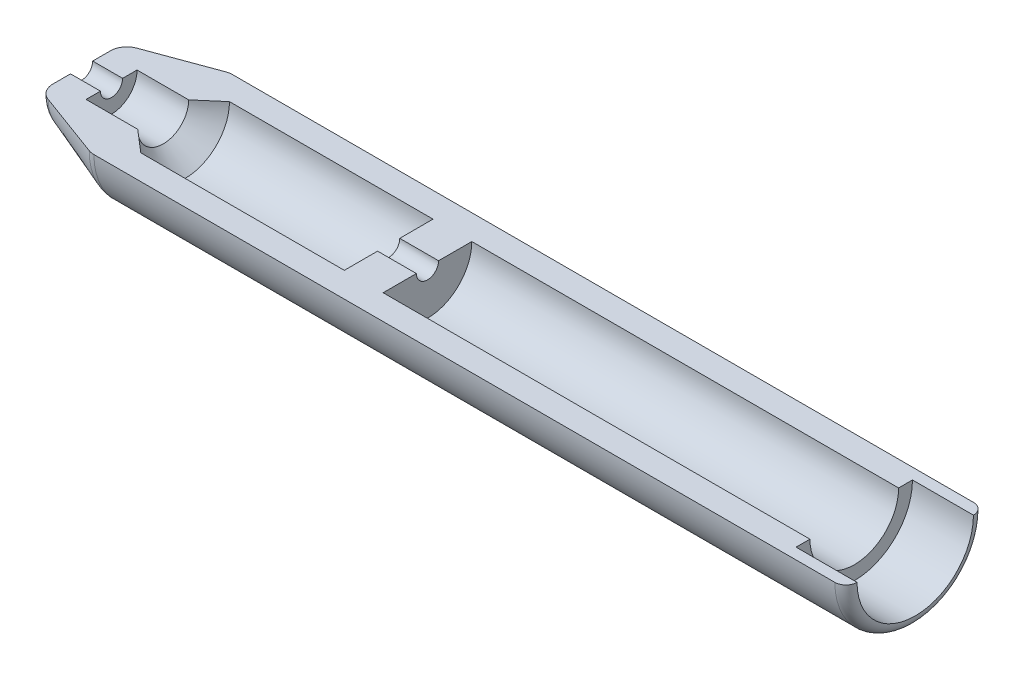
ISO-10303-21;
HEADER;
FILE_DESCRIPTION(('STEP AP214'),'2;1');
FILE_NAME('part.step','',(''),(''),'','','');
FILE_SCHEMA(('AUTOMOTIVE_DESIGN { 1 0 10303 214 1 1 1 1 }'));
ENDSEC;
DATA;
#1=APPLICATION_CONTEXT('core data for automotive mechanical design processes');
#2=APPLICATION_PROTOCOL_DEFINITION('international standard','automotive_design',2000,#1);
#3=PRODUCT_CONTEXT('',#1,'mechanical');
#4=PRODUCT('Part','Part','',(#3));
#5=PRODUCT_RELATED_PRODUCT_CATEGORY('part','',(#4));
#6=PRODUCT_DEFINITION_FORMATION('','',#4);
#7=PRODUCT_DEFINITION_CONTEXT('part definition',#1,'design');
#8=PRODUCT_DEFINITION('design','',#6,#7);
#9=PRODUCT_DEFINITION_SHAPE('','',#8);
#10=(LENGTH_UNIT() NAMED_UNIT(*) SI_UNIT(.MILLI.,.METRE.));
#11=(NAMED_UNIT(*) PLANE_ANGLE_UNIT() SI_UNIT($,.RADIAN.));
#12=(NAMED_UNIT(*) SI_UNIT($,.STERADIAN.) SOLID_ANGLE_UNIT());
#13=UNCERTAINTY_MEASURE_WITH_UNIT(LENGTH_MEASURE(1.E-05),#10,'distance_accuracy_value','');
#14=(GEOMETRIC_REPRESENTATION_CONTEXT(3) GLOBAL_UNCERTAINTY_ASSIGNED_CONTEXT((#13)) GLOBAL_UNIT_ASSIGNED_CONTEXT((#10,
#11,#12)) REPRESENTATION_CONTEXT('',''));
#15=CARTESIAN_POINT('',(0.,0.,0.));
#16=DIRECTION('',(0.,0.,1.));
#17=DIRECTION('',(1.,0.,0.));
#18=AXIS2_PLACEMENT_3D('',#15,#16,#17);
#19=CARTESIAN_POINT('',(-2.32246740661106,0.,-0.100000000000268));
#20=DIRECTION('',(1.,0.,0.));
#21=DIRECTION('',(0.,0.,-1.));
#22=AXIS2_PLACEMENT_3D('',#19,#20,#21);
#23=TOROIDAL_SURFACE('',#22,0.518463927586876,0.3);
#24=CARTESIAN_POINT('',(-2.62246740661106,0.,-0.100000000000268));
#25=DIRECTION('',(1.,0.,0.));
#26=DIRECTION('',(0.,0.,-1.));
#27=AXIS2_PLACEMENT_3D('',#24,#25,#26);
#28=CIRCLE('',#27,0.518463927586876);
#29=CARTESIAN_POINT('',(-2.62246740661106,0.,0.418463927586608));
#30=VERTEX_POINT('',#29);
#31=CARTESIAN_POINT('',(-2.62246740661106,0.,-0.618463927587144));
#32=VERTEX_POINT('',#31);
#33=EDGE_CURVE('E11',#30,#32,#28,.T.);
#34=ORIENTED_EDGE('',*,*,#33,.T.);
#35=CARTESIAN_POINT('',(-2.32246740661106,0.,-0.618463927587144));
#36=DIRECTION('',(0.,1.,0.));
#37=DIRECTION('',(0.,0.,1.));
#38=AXIS2_PLACEMENT_3D('',#35,#36,#37);
#39=CIRCLE('',#38,0.3);
#40=CARTESIAN_POINT('',(-2.42608902564006,0.,-0.900000000000268));
#41=VERTEX_POINT('',#40);
#42=EDGE_CURVE('E150',#41,#32,#39,.T.);
#43=ORIENTED_EDGE('',*,*,#42,.F.);
#44=CARTESIAN_POINT('',(-2.42608902564006,0.,-0.100000000000268));
#45=DIRECTION('',(1.,0.,0.));
#46=DIRECTION('',(0.,0.,-1.));
#47=AXIS2_PLACEMENT_3D('',#44,#45,#46);
#48=CIRCLE('',#47,0.8);
#49=CARTESIAN_POINT('',(-2.42608902564006,0.,0.699999999999732));
#50=VERTEX_POINT('',#49);
#51=EDGE_CURVE('E47',#50,#41,#48,.T.);
#52=ORIENTED_EDGE('',*,*,#51,.F.);
#53=CARTESIAN_POINT('',(-2.32246740661106,0.,0.418463927586608));
#54=DIRECTION('',(0.,-1.,0.));
#55=DIRECTION('',(0.,0.,-1.));
#56=AXIS2_PLACEMENT_3D('',#53,#54,#55);
#57=CIRCLE('',#56,0.3);
#58=EDGE_CURVE('E152',#50,#30,#57,.T.);
#59=ORIENTED_EDGE('',*,*,#58,.T.);
#60=EDGE_LOOP('',(#34,#43,#52,#59));
#61=FACE_BOUND('',#60,.T.);
#62=ADVANCED_FACE('F32',(#61),#23,.T.);
#63=CARTESIAN_POINT('',(-2.62246740661106,0.,0.418463927586608));
#64=DIRECTION('',(-1.,0.,0.));
#65=DIRECTION('',(0.,0.,1.));
#66=AXIS2_PLACEMENT_3D('',#63,#64,#65);
#67=PLANE('',#66);
#68=CARTESIAN_POINT('',(-2.62246740661106,0.,-0.100000000000268));
#69=DIRECTION('',(1.,0.,0.));
#70=DIRECTION('',(0.,0.,-1.));
#71=AXIS2_PLACEMENT_3D('',#68,#69,#70);
#72=CIRCLE('',#71,0.2);
#73=CARTESIAN_POINT('',(-2.62246740661106,0.,0.099999999999732));
#74=VERTEX_POINT('',#73);
#75=CARTESIAN_POINT('',(-2.62246740661106,0.,-0.300000000000268));
#76=VERTEX_POINT('',#75);
#77=EDGE_CURVE('E40',#74,#76,#72,.T.);
#78=ORIENTED_EDGE('',*,*,#77,.T.);
#79=DIRECTION('',(0.,0.,1.));
#80=VECTOR('',#79,1.);
#81=CARTESIAN_POINT('',(-2.62246740661106,0.,-0.618463927587144));
#82=LINE('',#81,#80);
#83=EDGE_CURVE('E161',#32,#76,#82,.T.);
#84=ORIENTED_EDGE('',*,*,#83,.F.);
#85=ORIENTED_EDGE('',*,*,#33,.F.);
#86=DIRECTION('',(0.,0.,-1.));
#87=VECTOR('',#86,1.);
#88=CARTESIAN_POINT('',(-2.62246740661106,0.,0.418463927586608));
#89=LINE('',#88,#87);
#90=EDGE_CURVE('E210',#30,#74,#89,.T.);
#91=ORIENTED_EDGE('',*,*,#90,.T.);
#92=EDGE_LOOP('',(#78,#84,#85,#91));
#93=FACE_BOUND('',#92,.T.);
#94=ADVANCED_FACE('F34',(#93),#67,.T.);
#95=CARTESIAN_POINT('',(-3.18503295530929,0.,-0.100000000000268));
#96=DIRECTION('',(1.,0.,0.));
#97=DIRECTION('',(0.,0.,-1.));
#98=AXIS2_PLACEMENT_3D('',#95,#96,#97);
#99=CYLINDRICAL_SURFACE('',#98,0.2);
#100=CARTESIAN_POINT('',(-2.08239037192044,0.,-0.100000000000268));
#101=DIRECTION('',(1.,0.,0.));
#102=DIRECTION('',(0.,0.,-1.));
#103=AXIS2_PLACEMENT_3D('',#100,#101,#102);
#104=CIRCLE('',#103,0.2);
#105=CARTESIAN_POINT('',(-2.08239037192044,0.,0.099999999999732));
#106=VERTEX_POINT('',#105);
#107=CARTESIAN_POINT('',(-2.08239037192044,0.,-0.300000000000268));
#108=VERTEX_POINT('',#107);
#109=EDGE_CURVE('E281',#106,#108,#104,.T.);
#110=ORIENTED_EDGE('',*,*,#109,.T.);
#111=DIRECTION('',(1.,0.,0.));
#112=VECTOR('',#111,1.);
#113=CARTESIAN_POINT('',(-2.08239037192044,0.,-0.300000000000268));
#114=LINE('',#113,#112);
#115=EDGE_CURVE('E166',#76,#108,#114,.T.);
#116=ORIENTED_EDGE('',*,*,#115,.F.);
#117=ORIENTED_EDGE('',*,*,#77,.F.);
#118=DIRECTION('',(1.,0.,0.));
#119=VECTOR('',#118,1.);
#120=CARTESIAN_POINT('',(-2.08239037192044,0.,0.099999999999732));
#121=LINE('',#120,#119);
#122=EDGE_CURVE('E212',#74,#106,#121,.T.);
#123=ORIENTED_EDGE('',*,*,#122,.T.);
#124=EDGE_LOOP('',(#110,#116,#117,#123));
#125=FACE_BOUND('',#124,.T.);
#126=ADVANCED_FACE('F283',(#125),#99,.F.);
#127=CARTESIAN_POINT('',(-2.08239037192044,0.,0.099999999999732));
#128=DIRECTION('',(1.,0.,0.));
#129=DIRECTION('',(0.,0.,-1.));
#130=AXIS2_PLACEMENT_3D('',#127,#128,#129);
#131=PLANE('',#130);
#132=CARTESIAN_POINT('',(-2.08239037192044,0.,-0.100000000000268));
#133=DIRECTION('',(1.,0.,0.));
#134=DIRECTION('',(0.,0.,-1.));
#135=AXIS2_PLACEMENT_3D('',#132,#133,#134);
#136=CIRCLE('',#135,0.46);
#137=CARTESIAN_POINT('',(-2.08239037192044,0.,0.359999999999732));
#138=VERTEX_POINT('',#137);
#139=CARTESIAN_POINT('',(-2.08239037192044,0.,-0.560000000000268));
#140=VERTEX_POINT('',#139);
#141=EDGE_CURVE('E279',#138,#140,#136,.T.);
#142=ORIENTED_EDGE('',*,*,#141,.T.);
#143=DIRECTION('',(0.,0.,-1.));
#144=VECTOR('',#143,1.);
#145=CARTESIAN_POINT('',(-2.08239037192044,0.,-0.300000000000268));
#146=LINE('',#145,#144);
#147=EDGE_CURVE('E168',#108,#140,#146,.T.);
#148=ORIENTED_EDGE('',*,*,#147,.F.);
#149=ORIENTED_EDGE('',*,*,#109,.F.);
#150=DIRECTION('',(0.,0.,1.));
#151=VECTOR('',#150,1.);
#152=CARTESIAN_POINT('',(-2.08239037192044,0.,0.099999999999732));
#153=LINE('',#152,#151);
#154=EDGE_CURVE('E215',#106,#138,#153,.T.);
#155=ORIENTED_EDGE('',*,*,#154,.T.);
#156=EDGE_LOOP('',(#142,#148,#149,#155));
#157=FACE_BOUND('',#156,.T.);
#158=ADVANCED_FACE('F289',(#157),#131,.T.);
#159=CARTESIAN_POINT('',(-3.18503295530929,0.,-0.100000000000268));
#160=DIRECTION('',(1.,0.,0.));
#161=DIRECTION('',(0.,0.,-1.));
#162=AXIS2_PLACEMENT_3D('',#159,#160,#161);
#163=CYLINDRICAL_SURFACE('',#162,0.46);
#164=CARTESIAN_POINT('',(-1.15,0.,-0.100000000000268));
#165=DIRECTION('',(1.,0.,0.));
#166=DIRECTION('',(0.,0.,-1.));
#167=AXIS2_PLACEMENT_3D('',#164,#165,#166);
#168=CIRCLE('',#167,0.46);
#169=CARTESIAN_POINT('',(-1.15,0.,0.359999999999732));
#170=VERTEX_POINT('',#169);
#171=CARTESIAN_POINT('',(-1.15,0.,-0.560000000000268));
#172=VERTEX_POINT('',#171);
#173=EDGE_CURVE('E277',#170,#172,#168,.T.);
#174=ORIENTED_EDGE('',*,*,#173,.T.);
#175=DIRECTION('',(1.,0.,0.));
#176=VECTOR('',#175,1.);
#177=CARTESIAN_POINT('',(-2.08239037192044,0.,-0.560000000000268));
#178=LINE('',#177,#176);
#179=EDGE_CURVE('E173',#140,#172,#178,.T.);
#180=ORIENTED_EDGE('',*,*,#179,.F.);
#181=ORIENTED_EDGE('',*,*,#141,.F.);
#182=DIRECTION('',(1.,0.,0.));
#183=VECTOR('',#182,1.);
#184=CARTESIAN_POINT('',(-2.08239037192044,0.,0.359999999999732));
#185=LINE('',#184,#183);
#186=EDGE_CURVE('E218',#138,#170,#185,.T.);
#187=ORIENTED_EDGE('',*,*,#186,.T.);
#188=EDGE_LOOP('',(#174,#180,#181,#187));
#189=FACE_BOUND('',#188,.T.);
#190=ADVANCED_FACE('F292',(#189),#163,.F.);
#191=CARTESIAN_POINT('',(-1.15,0.,-0.100000000000268));
#192=DIRECTION('',(1.,0.,0.));
#193=DIRECTION('',(0.,0.,-1.));
#194=AXIS2_PLACEMENT_3D('',#191,#192,#193);
#195=CONICAL_SURFACE('',#194,0.46,0.710018612411804);
#196=CARTESIAN_POINT('',(-0.754449261183806,0.,-0.100000000000268));
#197=DIRECTION('',(1.,0.,0.));
#198=DIRECTION('',(0.,0.,-1.));
#199=AXIS2_PLACEMENT_3D('',#196,#197,#198);
#200=CIRCLE('',#199,0.8);
#201=CARTESIAN_POINT('',(-0.754449261183806,0.,0.699999999999733));
#202=VERTEX_POINT('',#201);
#203=CARTESIAN_POINT('',(-0.754449261183806,0.,-0.900000000000268));
#204=VERTEX_POINT('',#203);
#205=EDGE_CURVE('E275',#202,#204,#200,.T.);
#206=ORIENTED_EDGE('',*,*,#205,.T.);
#207=DIRECTION('',(0.758349743660579,0.,-0.651847885852163));
#208=VECTOR('',#207,1.);
#209=CARTESIAN_POINT('',(-1.15,0.,-0.560000000000268));
#210=LINE('',#209,#208);
#211=EDGE_CURVE('E176',#172,#204,#210,.T.);
#212=ORIENTED_EDGE('',*,*,#211,.F.);
#213=ORIENTED_EDGE('',*,*,#173,.F.);
#214=DIRECTION('',(0.758349743660579,0.,0.651847885852163));
#215=VECTOR('',#214,1.);
#216=CARTESIAN_POINT('',(-1.15,0.,0.359999999999732));
#217=LINE('',#216,#215);
#218=EDGE_CURVE('E221',#170,#202,#217,.T.);
#219=ORIENTED_EDGE('',*,*,#218,.T.);
#220=EDGE_LOOP('',(#206,#212,#213,#219));
#221=FACE_BOUND('',#220,.T.);
#222=ADVANCED_FACE('F297',(#221),#195,.F.);
#223=CARTESIAN_POINT('',(-3.18503295530929,0.,-0.100000000000268));
#224=DIRECTION('',(1.,0.,0.));
#225=DIRECTION('',(0.,0.,-1.));
#226=AXIS2_PLACEMENT_3D('',#223,#224,#225);
#227=CYLINDRICAL_SURFACE('',#226,0.800000000000001);
#228=CARTESIAN_POINT('',(2.91760962807956,0.,-0.100000000000268));
#229=DIRECTION('',(1.,0.,0.));
#230=DIRECTION('',(0.,0.,-1.));
#231=AXIS2_PLACEMENT_3D('',#228,#229,#230);
#232=CIRCLE('',#231,0.800000000000001);
#233=CARTESIAN_POINT('',(2.91760962807956,0.,0.699999999999733));
#234=VERTEX_POINT('',#233);
#235=CARTESIAN_POINT('',(2.91760962807956,0.,-0.900000000000269));
#236=VERTEX_POINT('',#235);
#237=EDGE_CURVE('E273',#234,#236,#232,.T.);
#238=ORIENTED_EDGE('',*,*,#237,.T.);
#239=DIRECTION('',(1.,0.,0.));
#240=VECTOR('',#239,1.);
#241=CARTESIAN_POINT('',(-0.754449261183806,0.,-0.900000000000268));
#242=LINE('',#241,#240);
#243=EDGE_CURVE('E179',#204,#236,#242,.T.);
#244=ORIENTED_EDGE('',*,*,#243,.F.);
#245=ORIENTED_EDGE('',*,*,#205,.F.);
#246=DIRECTION('',(1.,0.,0.));
#247=VECTOR('',#246,1.);
#248=CARTESIAN_POINT('',(-0.754449261183806,0.,0.699999999999733));
#249=LINE('',#248,#247);
#250=EDGE_CURVE('E224',#202,#234,#249,.T.);
#251=ORIENTED_EDGE('',*,*,#250,.T.);
#252=EDGE_LOOP('',(#238,#244,#245,#251));
#253=FACE_BOUND('',#252,.T.);
#254=ADVANCED_FACE('F300',(#253),#227,.F.);
#255=CARTESIAN_POINT('',(2.91760962807956,0.,0.699999999999733));
#256=DIRECTION('',(-1.,0.,0.));
#257=DIRECTION('',(0.,0.,1.));
#258=AXIS2_PLACEMENT_3D('',#255,#256,#257);
#259=PLANE('',#258);
#260=CARTESIAN_POINT('',(2.91760962807956,0.,-0.100000000000268));
#261=DIRECTION('',(1.,0.,0.));
#262=DIRECTION('',(0.,0.,-1.));
#263=AXIS2_PLACEMENT_3D('',#260,#261,#262);
#264=CIRCLE('',#263,0.200000000000001);
#265=CARTESIAN_POINT('',(2.91760962807956,0.,0.0999999999997331));
#266=VERTEX_POINT('',#265);
#267=CARTESIAN_POINT('',(2.91760962807956,0.,-0.300000000000269));
#268=VERTEX_POINT('',#267);
#269=EDGE_CURVE('E271',#266,#268,#264,.T.);
#270=ORIENTED_EDGE('',*,*,#269,.T.);
#271=DIRECTION('',(0.,0.,1.));
#272=VECTOR('',#271,1.);
#273=CARTESIAN_POINT('',(2.91760962807956,0.,-0.900000000000269));
#274=LINE('',#273,#272);
#275=EDGE_CURVE('E182',#236,#268,#274,.T.);
#276=ORIENTED_EDGE('',*,*,#275,.F.);
#277=ORIENTED_EDGE('',*,*,#237,.F.);
#278=DIRECTION('',(0.,0.,-1.));
#279=VECTOR('',#278,1.);
#280=CARTESIAN_POINT('',(2.91760962807956,0.,0.699999999999733));
#281=LINE('',#280,#279);
#282=EDGE_CURVE('E227',#234,#266,#281,.T.);
#283=ORIENTED_EDGE('',*,*,#282,.T.);
#284=EDGE_LOOP('',(#270,#276,#277,#283));
#285=FACE_BOUND('',#284,.T.);
#286=ADVANCED_FACE('F305',(#285),#259,.T.);
#287=CARTESIAN_POINT('',(-3.18503295530929,0.,-0.100000000000268));
#288=DIRECTION('',(1.,0.,0.));
#289=DIRECTION('',(0.,0.,-1.));
#290=AXIS2_PLACEMENT_3D('',#287,#288,#289);
#291=CYLINDRICAL_SURFACE('',#290,0.200000000000001);
#292=CARTESIAN_POINT('',(3.61760962807956,0.,-0.100000000000268));
#293=DIRECTION('',(1.,0.,0.));
#294=DIRECTION('',(0.,0.,-1.));
#295=AXIS2_PLACEMENT_3D('',#292,#293,#294);
#296=CIRCLE('',#295,0.200000000000001);
#297=CARTESIAN_POINT('',(3.61760962807956,0.,0.0999999999997331));
#298=VERTEX_POINT('',#297);
#299=CARTESIAN_POINT('',(3.61760962807956,0.,-0.300000000000269));
#300=VERTEX_POINT('',#299);
#301=EDGE_CURVE('E269',#298,#300,#296,.T.);
#302=ORIENTED_EDGE('',*,*,#301,.T.);
#303=DIRECTION('',(1.,0.,0.));
#304=VECTOR('',#303,1.);
#305=CARTESIAN_POINT('',(2.91760962807956,0.,-0.300000000000269));
#306=LINE('',#305,#304);
#307=EDGE_CURVE('E185',#268,#300,#306,.T.);
#308=ORIENTED_EDGE('',*,*,#307,.F.);
#309=ORIENTED_EDGE('',*,*,#269,.F.);
#310=DIRECTION('',(1.,0.,0.));
#311=VECTOR('',#310,1.);
#312=CARTESIAN_POINT('',(2.91760962807956,0.,0.0999999999997331));
#313=LINE('',#312,#311);
#314=EDGE_CURVE('E230',#266,#298,#313,.T.);
#315=ORIENTED_EDGE('',*,*,#314,.T.);
#316=EDGE_LOOP('',(#302,#308,#309,#315));
#317=FACE_BOUND('',#316,.T.);
#318=ADVANCED_FACE('F308',(#317),#291,.F.);
#319=CARTESIAN_POINT('',(3.61760962807956,0.,0.0999999999997331));
#320=DIRECTION('',(1.,0.,0.));
#321=DIRECTION('',(0.,0.,-1.));
#322=AXIS2_PLACEMENT_3D('',#319,#320,#321);
#323=PLANE('',#322);
#324=CARTESIAN_POINT('',(3.61760962807956,0.,-0.100000000000268));
#325=DIRECTION('',(1.,0.,0.));
#326=DIRECTION('',(0.,0.,-1.));
#327=AXIS2_PLACEMENT_3D('',#324,#325,#326);
#328=CIRCLE('',#327,0.800000000000001);
#329=CARTESIAN_POINT('',(3.61760962807956,0.,0.699999999999733));
#330=VERTEX_POINT('',#329);
#331=CARTESIAN_POINT('',(3.61760962807956,0.,-0.900000000000269));
#332=VERTEX_POINT('',#331);
#333=EDGE_CURVE('E267',#330,#332,#328,.T.);
#334=ORIENTED_EDGE('',*,*,#333,.T.);
#335=DIRECTION('',(0.,0.,-1.));
#336=VECTOR('',#335,1.);
#337=CARTESIAN_POINT('',(3.61760962807956,0.,-0.300000000000269));
#338=LINE('',#337,#336);
#339=EDGE_CURVE('E188',#300,#332,#338,.T.);
#340=ORIENTED_EDGE('',*,*,#339,.F.);
#341=ORIENTED_EDGE('',*,*,#301,.F.);
#342=DIRECTION('',(0.,0.,1.));
#343=VECTOR('',#342,1.);
#344=CARTESIAN_POINT('',(3.61760962807956,0.,0.0999999999997331));
#345=LINE('',#344,#343);
#346=EDGE_CURVE('E233',#298,#330,#345,.T.);
#347=ORIENTED_EDGE('',*,*,#346,.T.);
#348=EDGE_LOOP('',(#334,#340,#341,#347));
#349=FACE_BOUND('',#348,.T.);
#350=ADVANCED_FACE('F313',(#349),#323,.T.);
#351=CARTESIAN_POINT('',(-3.18503295530929,0.,-0.100000000000268));
#352=DIRECTION('',(1.,0.,0.));
#353=DIRECTION('',(0.,0.,-1.));
#354=AXIS2_PLACEMENT_3D('',#351,#352,#353);
#355=CYLINDRICAL_SURFACE('',#354,0.800000000000001);
#356=CARTESIAN_POINT('',(11.3176096280796,0.,-0.100000000000268));
#357=DIRECTION('',(1.,0.,0.));
#358=DIRECTION('',(0.,0.,-1.));
#359=AXIS2_PLACEMENT_3D('',#356,#357,#358);
#360=CIRCLE('',#359,0.800000000000001);
#361=CARTESIAN_POINT('',(11.3176096280796,0.,0.699999999999733));
#362=VERTEX_POINT('',#361);
#363=CARTESIAN_POINT('',(11.3176096280796,0.,-0.900000000000269));
#364=VERTEX_POINT('',#363);
#365=EDGE_CURVE('E265',#362,#364,#360,.T.);
#366=ORIENTED_EDGE('',*,*,#365,.T.);
#367=DIRECTION('',(1.,0.,0.));
#368=VECTOR('',#367,1.);
#369=CARTESIAN_POINT('',(3.61760962807956,0.,-0.900000000000269));
#370=LINE('',#369,#368);
#371=EDGE_CURVE('E191',#332,#364,#370,.T.);
#372=ORIENTED_EDGE('',*,*,#371,.F.);
#373=ORIENTED_EDGE('',*,*,#333,.F.);
#374=DIRECTION('',(1.,0.,0.));
#375=VECTOR('',#374,1.);
#376=CARTESIAN_POINT('',(3.61760962807956,0.,0.699999999999733));
#377=LINE('',#376,#375);
#378=EDGE_CURVE('E236',#330,#362,#377,.T.);
#379=ORIENTED_EDGE('',*,*,#378,.T.);
#380=EDGE_LOOP('',(#366,#372,#373,#379));
#381=FACE_BOUND('',#380,.T.);
#382=ADVANCED_FACE('F316',(#381),#355,.F.);
#383=CARTESIAN_POINT('',(11.3176096280796,0.,0.949999999999733));
#384=DIRECTION('',(1.,0.,0.));
#385=DIRECTION('',(0.,0.,-1.));
#386=AXIS2_PLACEMENT_3D('',#383,#384,#385);
#387=PLANE('',#386);
#388=CARTESIAN_POINT('',(11.3176096280796,0.,-0.100000000000268));
#389=DIRECTION('',(1.,0.,0.));
#390=DIRECTION('',(0.,0.,-1.));
#391=AXIS2_PLACEMENT_3D('',#388,#389,#390);
#392=CIRCLE('',#391,1.05);
#393=CARTESIAN_POINT('',(11.3176096280796,0.,0.949999999999733));
#394=VERTEX_POINT('',#393);
#395=CARTESIAN_POINT('',(11.3176096280796,0.,-1.15000000000027));
#396=VERTEX_POINT('',#395);
#397=EDGE_CURVE('E263',#394,#396,#392,.T.);
#398=ORIENTED_EDGE('',*,*,#397,.T.);
#399=DIRECTION('',(0.,0.,-1.));
#400=VECTOR('',#399,1.);
#401=CARTESIAN_POINT('',(11.3176096280796,0.,-1.15000000000027));
#402=LINE('',#401,#400);
#403=EDGE_CURVE('E194',#364,#396,#402,.T.);
#404=ORIENTED_EDGE('',*,*,#403,.F.);
#405=ORIENTED_EDGE('',*,*,#365,.F.);
#406=DIRECTION('',(0.,0.,1.));
#407=VECTOR('',#406,1.);
#408=CARTESIAN_POINT('',(11.3176096280796,0.,0.949999999999733));
#409=LINE('',#408,#407);
#410=EDGE_CURVE('E239',#362,#394,#409,.T.);
#411=ORIENTED_EDGE('',*,*,#410,.T.);
#412=EDGE_LOOP('',(#398,#404,#405,#411));
#413=FACE_BOUND('',#412,.T.);
#414=ADVANCED_FACE('F321',(#413),#387,.T.);
#415=CARTESIAN_POINT('',(-3.18503295530929,0.,-0.100000000000268));
#416=DIRECTION('',(1.,0.,0.));
#417=DIRECTION('',(0.,0.,-1.));
#418=AXIS2_PLACEMENT_3D('',#415,#416,#417);
#419=CYLINDRICAL_SURFACE('',#418,1.05);
#420=CARTESIAN_POINT('',(12.4176096280796,0.,-0.100000000000268));
#421=DIRECTION('',(1.,0.,0.));
#422=DIRECTION('',(0.,0.,-1.));
#423=AXIS2_PLACEMENT_3D('',#420,#421,#422);
#424=CIRCLE('',#423,1.05);
#425=CARTESIAN_POINT('',(12.4176096280796,0.,0.949999999999733));
#426=VERTEX_POINT('',#425);
#427=CARTESIAN_POINT('',(12.4176096280796,0.,-1.15000000000027));
#428=VERTEX_POINT('',#427);
#429=EDGE_CURVE('E261',#426,#428,#424,.T.);
#430=ORIENTED_EDGE('',*,*,#429,.T.);
#431=DIRECTION('',(1.,0.,0.));
#432=VECTOR('',#431,1.);
#433=CARTESIAN_POINT('',(12.4176096280796,0.,-1.15000000000027));
#434=LINE('',#433,#432);
#435=EDGE_CURVE('E197',#396,#428,#434,.T.);
#436=ORIENTED_EDGE('',*,*,#435,.F.);
#437=ORIENTED_EDGE('',*,*,#397,.F.);
#438=DIRECTION('',(1.,0.,0.));
#439=VECTOR('',#438,1.);
#440=CARTESIAN_POINT('',(12.4176096280796,0.,0.949999999999733));
#441=LINE('',#440,#439);
#442=EDGE_CURVE('E242',#394,#426,#441,.T.);
#443=ORIENTED_EDGE('',*,*,#442,.T.);
#444=EDGE_LOOP('',(#430,#436,#437,#443));
#445=FACE_BOUND('',#444,.T.);
#446=ADVANCED_FACE('F324',(#445),#419,.F.);
#447=CARTESIAN_POINT('',(12.2176096280796,0.,-0.100000000000268));
#448=DIRECTION('',(1.,0.,0.));
#449=DIRECTION('',(0.,0.,-1.));
#450=AXIS2_PLACEMENT_3D('',#447,#448,#449);
#451=TOROIDAL_SURFACE('',#450,1.05,0.2);
#452=CARTESIAN_POINT('',(12.2176096280796,0.,-0.100000000000268));
#453=DIRECTION('',(1.,0.,0.));
#454=DIRECTION('',(0.,0.,-1.));
#455=AXIS2_PLACEMENT_3D('',#452,#453,#454);
#456=CIRCLE('',#455,1.25);
#457=CARTESIAN_POINT('',(12.2176096280796,0.,1.14999999999973));
#458=VERTEX_POINT('',#457);
#459=CARTESIAN_POINT('',(12.2176096280796,0.,-1.35000000000027));
#460=VERTEX_POINT('',#459);
#461=EDGE_CURVE('E259',#458,#460,#456,.T.);
#462=ORIENTED_EDGE('',*,*,#461,.T.);
#463=CARTESIAN_POINT('',(12.2176096280796,0.,-1.15000000000027));
#464=DIRECTION('',(0.,1.,0.));
#465=DIRECTION('',(0.,0.,-1.));
#466=AXIS2_PLACEMENT_3D('',#463,#464,#465);
#467=CIRCLE('',#466,0.2);
#468=EDGE_CURVE('E200',#428,#460,#467,.T.);
#469=ORIENTED_EDGE('',*,*,#468,.F.);
#470=ORIENTED_EDGE('',*,*,#429,.F.);
#471=CARTESIAN_POINT('',(12.2176096280796,0.,0.949999999999732));
#472=DIRECTION('',(0.,-1.,0.));
#473=DIRECTION('',(0.,0.,1.));
#474=AXIS2_PLACEMENT_3D('',#471,#472,#473);
#475=CIRCLE('',#474,0.2);
#476=EDGE_CURVE('E245',#426,#458,#475,.T.);
#477=ORIENTED_EDGE('',*,*,#476,.T.);
#478=EDGE_LOOP('',(#462,#469,#470,#477));
#479=FACE_BOUND('',#478,.T.);
#480=ADVANCED_FACE('F329',(#479),#451,.T.);
#481=CARTESIAN_POINT('',(-3.18503295530929,0.,-0.100000000000268));
#482=DIRECTION('',(1.,0.,0.));
#483=DIRECTION('',(0.,0.,-1.));
#484=AXIS2_PLACEMENT_3D('',#481,#482,#483);
#485=CYLINDRICAL_SURFACE('',#484,1.25);
#486=CARTESIAN_POINT('',(-1.15,0.,-0.100000000000268));
#487=DIRECTION('',(1.,0.,0.));
#488=DIRECTION('',(0.,0.,-1.));
#489=AXIS2_PLACEMENT_3D('',#486,#487,#488);
#490=CIRCLE('',#489,1.25);
#491=CARTESIAN_POINT('',(-1.15,0.,1.14999999999973));
#492=VERTEX_POINT('',#491);
#493=CARTESIAN_POINT('',(-1.15,0.,-1.35000000000027));
#494=VERTEX_POINT('',#493);
#495=EDGE_CURVE('E257',#492,#494,#490,.T.);
#496=ORIENTED_EDGE('',*,*,#495,.T.);
#497=DIRECTION('',(-1.,0.,0.));
#498=VECTOR('',#497,1.);
#499=CARTESIAN_POINT('',(12.2176096280796,0.,-1.35000000000027));
#500=LINE('',#499,#498);
#501=EDGE_CURVE('E203',#460,#494,#500,.T.);
#502=ORIENTED_EDGE('',*,*,#501,.F.);
#503=ORIENTED_EDGE('',*,*,#461,.F.);
#504=DIRECTION('',(-1.,0.,0.));
#505=VECTOR('',#504,1.);
#506=CARTESIAN_POINT('',(12.2176096280796,0.,1.14999999999973));
#507=LINE('',#506,#505);
#508=EDGE_CURVE('E248',#458,#492,#507,.T.);
#509=ORIENTED_EDGE('',*,*,#508,.T.);
#510=EDGE_LOOP('',(#496,#502,#503,#509));
#511=FACE_BOUND('',#510,.T.);
#512=ADVANCED_FACE('F332',(#511),#485,.T.);
#513=CARTESIAN_POINT('',(-1.15,0.,-0.100000000000268));
#514=DIRECTION('',(1.,0.,0.));
#515=DIRECTION('',(0.,0.,-1.));
#516=AXIS2_PLACEMENT_3D('',#513,#514,#515);
#517=TOROIDAL_SURFACE('',#516,0.949999999999999,0.3);
#518=CARTESIAN_POINT('',(-1.25362161902901,0.,-0.100000000000268));
#519=DIRECTION('',(1.,0.,0.));
#520=DIRECTION('',(0.,0.,-1.));
#521=AXIS2_PLACEMENT_3D('',#518,#519,#520);
#522=CIRCLE('',#521,1.23153607241312);
#523=CARTESIAN_POINT('',(-1.25362161902901,0.,1.13153607241285));
#524=VERTEX_POINT('',#523);
#525=CARTESIAN_POINT('',(-1.25362161902901,0.,-1.33153607241339));
#526=VERTEX_POINT('',#525);
#527=EDGE_CURVE('E55',#524,#526,#522,.T.);
#528=ORIENTED_EDGE('',*,*,#527,.T.);
#529=CARTESIAN_POINT('',(-1.15,0.,-1.05000000000027));
#530=DIRECTION('',(0.,1.,0.));
#531=DIRECTION('',(0.,0.,-1.));
#532=AXIS2_PLACEMENT_3D('',#529,#530,#531);
#533=CIRCLE('',#532,0.3);
#534=EDGE_CURVE('E206',#494,#526,#533,.T.);
#535=ORIENTED_EDGE('',*,*,#534,.F.);
#536=ORIENTED_EDGE('',*,*,#495,.F.);
#537=CARTESIAN_POINT('',(-1.15,0.,0.849999999999731));
#538=DIRECTION('',(0.,-1.,0.));
#539=DIRECTION('',(0.,0.,1.));
#540=AXIS2_PLACEMENT_3D('',#537,#538,#539);
#541=CIRCLE('',#540,0.3);
#542=EDGE_CURVE('E251',#492,#524,#541,.T.);
#543=ORIENTED_EDGE('',*,*,#542,.T.);
#544=EDGE_LOOP('',(#528,#535,#536,#543));
#545=FACE_BOUND('',#544,.T.);
#546=ADVANCED_FACE('F336',(#545),#517,.T.);
#547=CARTESIAN_POINT('',(-1.25362161902901,0.,-0.100000000000268));
#548=DIRECTION('',(1.,0.,0.));
#549=DIRECTION('',(0.,0.,-1.));
#550=AXIS2_PLACEMENT_3D('',#547,#548,#549);
#551=CONICAL_SURFACE('',#550,1.23153607241312,0.35267073459776);
#552=DIRECTION('',(-0.938453574710413,0.,-0.345405396763349));
#553=VECTOR('',#552,1.);
#554=CARTESIAN_POINT('',(-2.42608902564006,0.,0.699999999999732));
#555=LINE('',#554,#553);
#556=EDGE_CURVE('E253',#524,#50,#555,.T.);
#557=ORIENTED_EDGE('',*,*,#556,.T.);
#558=ORIENTED_EDGE('',*,*,#51,.T.);
#559=DIRECTION('',(-0.938453574710413,0.,0.345405396763349));
#560=VECTOR('',#559,1.);
#561=CARTESIAN_POINT('',(-2.42608902564006,0.,-0.900000000000268));
#562=LINE('',#561,#560);
#563=EDGE_CURVE('E164',#526,#41,#562,.T.);
#564=ORIENTED_EDGE('',*,*,#563,.F.);
#565=ORIENTED_EDGE('',*,*,#527,.F.);
#566=EDGE_LOOP('',(#557,#558,#564,#565));
#567=FACE_BOUND('',#566,.T.);
#568=ADVANCED_FACE('F340',(#567),#551,.T.);
#569=CARTESIAN_POINT('',(-2.32246740661106,0.,0.418463927586608));
#570=DIRECTION('',(0.,-1.,0.));
#571=DIRECTION('',(0.,0.,-1.));
#572=AXIS2_PLACEMENT_3D('',#569,#570,#571);
#573=PLANE('',#572);
#574=ORIENTED_EDGE('',*,*,#58,.F.);
#575=ORIENTED_EDGE('',*,*,#556,.F.);
#576=ORIENTED_EDGE('',*,*,#542,.F.);
#577=ORIENTED_EDGE('',*,*,#508,.F.);
#578=ORIENTED_EDGE('',*,*,#476,.F.);
#579=ORIENTED_EDGE('',*,*,#442,.F.);
#580=ORIENTED_EDGE('',*,*,#410,.F.);
#581=ORIENTED_EDGE('',*,*,#378,.F.);
#582=ORIENTED_EDGE('',*,*,#346,.F.);
#583=ORIENTED_EDGE('',*,*,#314,.F.);
#584=ORIENTED_EDGE('',*,*,#282,.F.);
#585=ORIENTED_EDGE('',*,*,#250,.F.);
#586=ORIENTED_EDGE('',*,*,#218,.F.);
#587=ORIENTED_EDGE('',*,*,#186,.F.);
#588=ORIENTED_EDGE('',*,*,#154,.F.);
#589=ORIENTED_EDGE('',*,*,#122,.F.);
#590=ORIENTED_EDGE('',*,*,#90,.F.);
#591=EDGE_LOOP('',(#574,#575,#576,#577,#578,#579,#580,#581,#582,#583,#584,#585,#586,#587,#588,
#589,#590));
#592=FACE_BOUND('',#591,.T.);
#593=ADVANCED_FACE('F339',(#592),#573,.F.);
#594=CARTESIAN_POINT('',(-2.32246740661106,0.,-0.618463927587144));
#595=DIRECTION('',(0.,1.,0.));
#596=DIRECTION('',(0.,0.,1.));
#597=AXIS2_PLACEMENT_3D('',#594,#595,#596);
#598=PLANE('',#597);
#599=ORIENTED_EDGE('',*,*,#42,.T.);
#600=ORIENTED_EDGE('',*,*,#83,.T.);
#601=ORIENTED_EDGE('',*,*,#115,.T.);
#602=ORIENTED_EDGE('',*,*,#147,.T.);
#603=ORIENTED_EDGE('',*,*,#179,.T.);
#604=ORIENTED_EDGE('',*,*,#211,.T.);
#605=ORIENTED_EDGE('',*,*,#243,.T.);
#606=ORIENTED_EDGE('',*,*,#275,.T.);
#607=ORIENTED_EDGE('',*,*,#307,.T.);
#608=ORIENTED_EDGE('',*,*,#339,.T.);
#609=ORIENTED_EDGE('',*,*,#371,.T.);
#610=ORIENTED_EDGE('',*,*,#403,.T.);
#611=ORIENTED_EDGE('',*,*,#435,.T.);
#612=ORIENTED_EDGE('',*,*,#468,.T.);
#613=ORIENTED_EDGE('',*,*,#501,.T.);
#614=ORIENTED_EDGE('',*,*,#534,.T.);
#615=ORIENTED_EDGE('',*,*,#563,.T.);
#616=EDGE_LOOP('',(#599,#600,#601,#602,#603,#604,#605,#606,#607,#608,#609,#610,#611,#612,#613,
#614,#615));
#617=FACE_BOUND('',#616,.T.);
#618=ADVANCED_FACE('F159',(#617),#598,.T.);
#619=CLOSED_SHELL('',(#62,#94,#126,#158,#190,#222,#254,#286,#318,#350,#382,#414,#446,#480,#512,
#546,#568,#593,#618));
#620=MANIFOLD_SOLID_BREP('B2',#619);
#621=ADVANCED_BREP_SHAPE_REPRESENTATION('',(#18,#620),#14);
#622=SHAPE_DEFINITION_REPRESENTATION(#9,#621);
ENDSEC;
END-ISO-10303-21;
